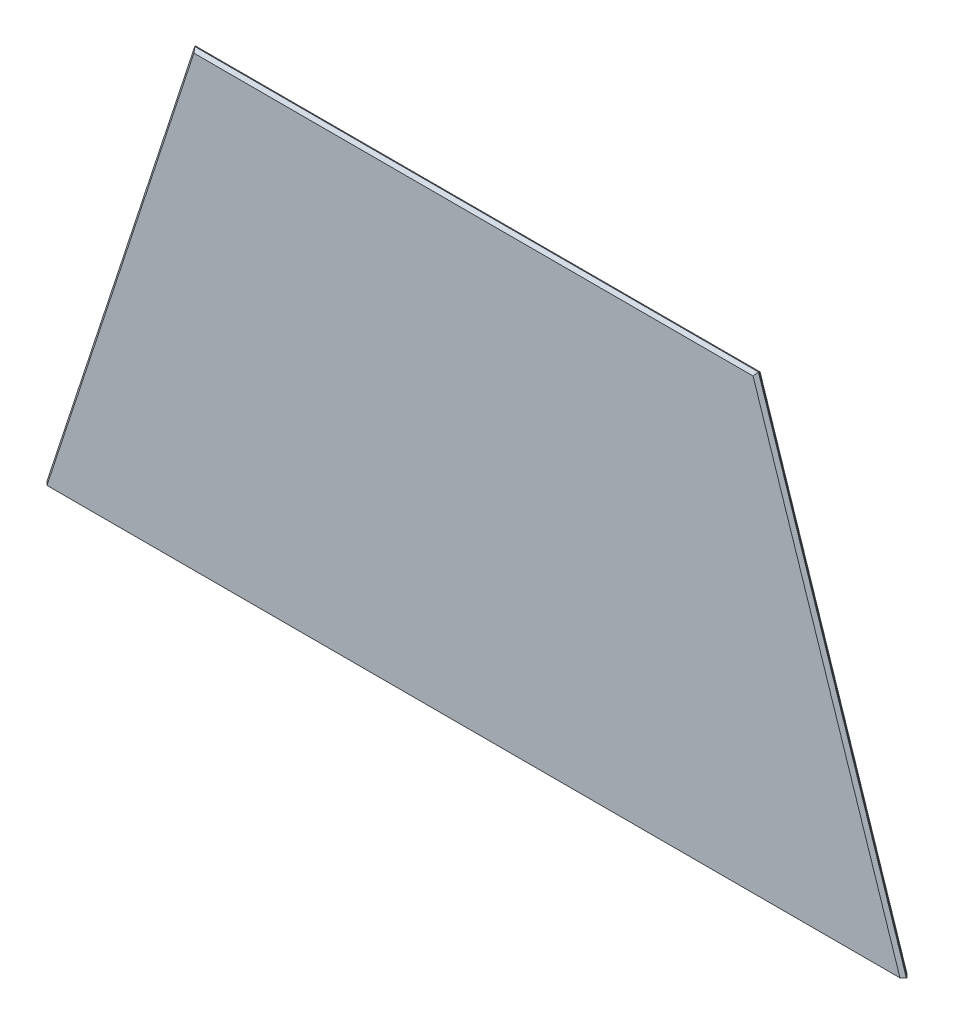
ISO-10303-21;
HEADER;
FILE_DESCRIPTION(('STEP AP214'),'2;1');
FILE_NAME('part.step','',(''),(''),'','','');
FILE_SCHEMA(('AUTOMOTIVE_DESIGN { 1 0 10303 214 1 1 1 1 }'));
ENDSEC;
DATA;
#1=APPLICATION_CONTEXT('core data for automotive mechanical design processes');
#2=APPLICATION_PROTOCOL_DEFINITION('international standard','automotive_design',2000,#1);
#3=PRODUCT_CONTEXT('',#1,'mechanical');
#4=PRODUCT('Part','Part','',(#3));
#5=PRODUCT_RELATED_PRODUCT_CATEGORY('part','',(#4));
#6=PRODUCT_DEFINITION_FORMATION('','',#4);
#7=PRODUCT_DEFINITION_CONTEXT('part definition',#1,'design');
#8=PRODUCT_DEFINITION('design','',#6,#7);
#9=PRODUCT_DEFINITION_SHAPE('','',#8);
#10=(LENGTH_UNIT() NAMED_UNIT(*) SI_UNIT(.MILLI.,.METRE.));
#11=(NAMED_UNIT(*) PLANE_ANGLE_UNIT() SI_UNIT($,.RADIAN.));
#12=(NAMED_UNIT(*) SI_UNIT($,.STERADIAN.) SOLID_ANGLE_UNIT());
#13=UNCERTAINTY_MEASURE_WITH_UNIT(LENGTH_MEASURE(1.E-05),#10,'distance_accuracy_value','');
#14=(GEOMETRIC_REPRESENTATION_CONTEXT(3) GLOBAL_UNCERTAINTY_ASSIGNED_CONTEXT((#13)) GLOBAL_UNIT_ASSIGNED_CONTEXT((#10,
#11,#12)) REPRESENTATION_CONTEXT('',''));
#15=CARTESIAN_POINT('',(0.,0.,0.));
#16=DIRECTION('',(0.,0.,1.));
#17=DIRECTION('',(1.,0.,0.));
#18=AXIS2_PLACEMENT_3D('',#15,#16,#17);
#19=CARTESIAN_POINT('',(0.,0.,1.5875));
#20=DIRECTION('',(0.,1.,0.));
#21=DIRECTION('',(0.,0.,1.));
#22=AXIS2_PLACEMENT_3D('',#19,#20,#21);
#23=PLANE('',#22);
#24=DIRECTION('',(1.,0.,0.));
#25=VECTOR('',#24,1.);
#26=CARTESIAN_POINT('',(0.,0.,-1.5875));
#27=LINE('',#26,#25);
#28=CARTESIAN_POINT('',(-192.204717385981,0.,-1.5875));
#29=VERTEX_POINT('',#28);
#30=CARTESIAN_POINT('',(192.204717385981,0.,-1.58749999999998));
#31=VERTEX_POINT('',#30);
#32=EDGE_CURVE('E159',#29,#31,#27,.T.);
#33=ORIENTED_EDGE('',*,*,#32,.T.);
#34=DIRECTION('',(-0.724942429921074,0.,-0.688809460809104));
#35=VECTOR('',#34,1.);
#36=CARTESIAN_POINT('',(193.675,0.,-0.190500000000129));
#37=LINE('',#36,#35);
#38=CARTESIAN_POINT('',(193.675,0.,-0.19050000000013));
#39=VERTEX_POINT('',#38);
#40=EDGE_CURVE('E130',#31,#39,#37,.F.);
#41=ORIENTED_EDGE('',*,*,#40,.T.);
#42=DIRECTION('',(0.,0.,-1.));
#43=VECTOR('',#42,1.);
#44=CARTESIAN_POINT('',(193.675,0.,1.5875));
#45=LINE('',#44,#43);
#46=CARTESIAN_POINT('',(193.675,0.,0.190499999999915));
#47=VERTEX_POINT('',#46);
#48=EDGE_CURVE('E141',#47,#39,#45,.T.);
#49=ORIENTED_EDGE('',*,*,#48,.F.);
#50=DIRECTION('',(-0.724942429921077,0.,0.688809460809101));
#51=VECTOR('',#50,1.);
#52=CARTESIAN_POINT('',(192.279823911265,0.,1.51613697440055));
#53=LINE('',#52,#51);
#54=CARTESIAN_POINT('',(192.204717385981,0.,1.58749999999994));
#55=VERTEX_POINT('',#54);
#56=EDGE_CURVE('E145',#47,#55,#53,.T.);
#57=ORIENTED_EDGE('',*,*,#56,.T.);
#58=DIRECTION('',(1.,0.,0.));
#59=VECTOR('',#58,1.);
#60=CARTESIAN_POINT('',(-193.675,0.,1.5875));
#61=LINE('',#60,#59);
#62=CARTESIAN_POINT('',(-192.20471738598,0.,1.58749999999999));
#63=VERTEX_POINT('',#62);
#64=EDGE_CURVE('E199',#63,#55,#61,.T.);
#65=ORIENTED_EDGE('',*,*,#64,.F.);
#66=DIRECTION('',(-0.724942429921092,0.,-0.688809460809085));
#67=VECTOR('',#66,1.);
#68=CARTESIAN_POINT('',(-172.492803176873,0.,20.3169224168507));
#69=LINE('',#68,#67);
#70=CARTESIAN_POINT('',(-193.675,0.,0.1904999999999));
#71=VERTEX_POINT('',#70);
#72=EDGE_CURVE('E181',#63,#71,#69,.T.);
#73=ORIENTED_EDGE('',*,*,#72,.T.);
#74=DIRECTION('',(0.,0.,-1.));
#75=VECTOR('',#74,1.);
#76=CARTESIAN_POINT('',(-193.675,0.,1.5875));
#77=LINE('',#76,#75);
#78=CARTESIAN_POINT('',(-193.675,0.,-0.190500000000136));
#79=VERTEX_POINT('',#78);
#80=EDGE_CURVE('E196',#71,#79,#77,.T.);
#81=ORIENTED_EDGE('',*,*,#80,.T.);
#82=DIRECTION('',(-0.724942429921075,0.,0.688809460809103));
#83=VECTOR('',#82,1.);
#84=CARTESIAN_POINT('',(-158.634518707286,0.,-33.4844748448075));
#85=LINE('',#84,#83);
#86=EDGE_CURVE('E177',#79,#29,#85,.F.);
#87=ORIENTED_EDGE('',*,*,#86,.T.);
#88=EDGE_LOOP('',(#33,#41,#49,#57,#65,#73,#81,#87));
#89=FACE_BOUND('',#88,.T.);
#90=ADVANCED_FACE('F38',(#89),#23,.F.);
#91=CARTESIAN_POINT('',(193.675,0.,1.5875));
#92=DIRECTION('',(-0.950157464068001,-0.311770417897313,0.));
#93=DIRECTION('',(0.311770417897313,-0.950157464068001,0.));
#94=AXIS2_PLACEMENT_3D('',#91,#92,#93);
#95=PLANE('',#94);
#96=ORIENTED_EDGE('',*,*,#48,.T.);
#97=DIRECTION('',(-0.311770417897313,0.950157464068001,0.));
#98=VECTOR('',#97,1.);
#99=CARTESIAN_POINT('',(193.675,0.,-0.190500000000138));
#100=LINE('',#99,#98);
#101=CARTESIAN_POINT('',(127.,203.2,-0.190500000000129));
#102=VERTEX_POINT('',#101);
#103=EDGE_CURVE('E139',#39,#102,#100,.T.);
#104=ORIENTED_EDGE('',*,*,#103,.T.);
#105=DIRECTION('',(0.,0.,-1.));
#106=VECTOR('',#105,1.);
#107=CARTESIAN_POINT('',(127.,203.2,1.5875));
#108=LINE('',#107,#106);
#109=CARTESIAN_POINT('',(127.,203.2,0.190499999999907));
#110=VERTEX_POINT('',#109);
#111=EDGE_CURVE('E122',#110,#102,#108,.T.);
#112=ORIENTED_EDGE('',*,*,#111,.F.);
#113=DIRECTION('',(0.311770417897313,-0.950157464068001,0.));
#114=VECTOR('',#113,1.);
#115=CARTESIAN_POINT('',(193.675,0.,0.190499999999907));
#116=LINE('',#115,#114);
#117=EDGE_CURVE('E136',#110,#47,#116,.T.);
#118=ORIENTED_EDGE('',*,*,#117,.T.);
#119=EDGE_LOOP('',(#96,#104,#112,#118));
#120=FACE_BOUND('',#119,.T.);
#121=ADVANCED_FACE('F135',(#120),#95,.F.);
#122=CARTESIAN_POINT('',(0.,203.2,1.5875));
#123=DIRECTION('',(0.,-1.,0.));
#124=DIRECTION('',(0.,0.,-1.));
#125=AXIS2_PLACEMENT_3D('',#122,#123,#124);
#126=PLANE('',#125);
#127=ORIENTED_EDGE('',*,*,#111,.T.);
#128=DIRECTION('',(-1.,0.,0.));
#129=VECTOR('',#128,1.);
#130=CARTESIAN_POINT('',(0.,203.2,-0.190500000000129));
#131=LINE('',#130,#129);
#132=CARTESIAN_POINT('',(-127.,203.2,-0.190500000000129));
#133=VERTEX_POINT('',#132);
#134=EDGE_CURVE('E129',#102,#133,#131,.T.);
#135=ORIENTED_EDGE('',*,*,#134,.T.);
#136=DIRECTION('',(0.,0.,-1.));
#137=VECTOR('',#136,1.);
#138=CARTESIAN_POINT('',(-127.,203.2,1.5875));
#139=LINE('',#138,#137);
#140=CARTESIAN_POINT('',(-127.,203.2,0.190499999999907));
#141=VERTEX_POINT('',#140);
#142=EDGE_CURVE('E124',#141,#133,#139,.T.);
#143=ORIENTED_EDGE('',*,*,#142,.F.);
#144=DIRECTION('',(1.,0.,0.));
#145=VECTOR('',#144,1.);
#146=CARTESIAN_POINT('',(127.,203.2,0.190499999999907));
#147=LINE('',#146,#145);
#148=EDGE_CURVE('E119',#141,#110,#147,.T.);
#149=ORIENTED_EDGE('',*,*,#148,.T.);
#150=EDGE_LOOP('',(#127,#135,#143,#149));
#151=FACE_BOUND('',#150,.T.);
#152=ADVANCED_FACE('F121',(#151),#126,.F.);
#153=CARTESIAN_POINT('',(-127.,203.2,1.5875));
#154=DIRECTION('',(0.950157464068001,-0.311770417897313,0.));
#155=DIRECTION('',(0.311770417897313,0.950157464068001,0.));
#156=AXIS2_PLACEMENT_3D('',#153,#154,#155);
#157=PLANE('',#156);
#158=ORIENTED_EDGE('',*,*,#142,.T.);
#159=DIRECTION('',(-0.311770417897313,-0.950157464068001,0.));
#160=VECTOR('',#159,1.);
#161=CARTESIAN_POINT('',(-127.,203.2,-0.190500000000142));
#162=LINE('',#161,#160);
#163=EDGE_CURVE('E167',#133,#79,#162,.T.);
#164=ORIENTED_EDGE('',*,*,#163,.T.);
#165=ORIENTED_EDGE('',*,*,#80,.F.);
#166=DIRECTION('',(0.311770417897313,0.950157464068001,0.));
#167=VECTOR('',#166,1.);
#168=CARTESIAN_POINT('',(-127.,203.2,0.1904999999999));
#169=LINE('',#168,#167);
#170=EDGE_CURVE('E170',#71,#141,#169,.T.);
#171=ORIENTED_EDGE('',*,*,#170,.T.);
#172=EDGE_LOOP('',(#158,#164,#165,#171));
#173=FACE_BOUND('',#172,.T.);
#174=ADVANCED_FACE('F213',(#173),#157,.F.);
#175=CARTESIAN_POINT('',(193.675,0.,1.5875));
#176=DIRECTION('',(0.,0.,1.));
#177=DIRECTION('',(1.,0.,0.));
#178=AXIS2_PLACEMENT_3D('',#175,#176,#177);
#179=PLANE('',#178);
#180=ORIENTED_EDGE('',*,*,#64,.T.);
#181=DIRECTION('',(-0.311770417897313,0.950157464068001,0.));
#182=VECTOR('',#181,1.);
#183=CARTESIAN_POINT('',(125.672630022697,202.764456726197,1.5875));
#184=LINE('',#183,#182);
#185=CARTESIAN_POINT('',(125.98810801098,201.803,1.5875));
#186=VERTEX_POINT('',#185);
#187=EDGE_CURVE('E11',#55,#186,#184,.T.);
#188=ORIENTED_EDGE('',*,*,#187,.T.);
#189=DIRECTION('',(-1.,0.,0.));
#190=VECTOR('',#189,1.);
#191=CARTESIAN_POINT('',(-127.,201.803,1.5875));
#192=LINE('',#191,#190);
#193=CARTESIAN_POINT('',(-125.98810801098,201.803,1.5875));
#194=VERTEX_POINT('',#193);
#195=EDGE_CURVE('E48',#186,#194,#192,.T.);
#196=ORIENTED_EDGE('',*,*,#195,.T.);
#197=DIRECTION('',(-0.311770417897313,-0.950157464068001,0.));
#198=VECTOR('',#197,1.);
#199=CARTESIAN_POINT('',(-192.347630022697,-0.4355432738026,1.5875));
#200=LINE('',#199,#198);
#201=EDGE_CURVE('E164',#194,#63,#200,.T.);
#202=ORIENTED_EDGE('',*,*,#201,.T.);
#203=EDGE_LOOP('',(#180,#188,#196,#202));
#204=FACE_BOUND('',#203,.T.);
#205=ADVANCED_FACE('F206',(#204),#179,.T.);
#206=CARTESIAN_POINT('',(193.675,0.,-1.5875));
#207=DIRECTION('',(0.,0.,1.));
#208=DIRECTION('',(1.,0.,0.));
#209=AXIS2_PLACEMENT_3D('',#206,#207,#208);
#210=PLANE('',#209);
#211=DIRECTION('',(1.,0.,0.));
#212=VECTOR('',#211,1.);
#213=CARTESIAN_POINT('',(193.675,201.803,-1.5875));
#214=LINE('',#213,#212);
#215=CARTESIAN_POINT('',(-125.988108010981,201.803,-1.5875));
#216=VERTEX_POINT('',#215);
#217=CARTESIAN_POINT('',(125.988108010981,201.803,-1.5875));
#218=VERTEX_POINT('',#217);
#219=EDGE_CURVE('E186',#216,#218,#214,.T.);
#220=ORIENTED_EDGE('',*,*,#219,.T.);
#221=DIRECTION('',(0.311770417897313,-0.950157464068001,0.));
#222=VECTOR('',#221,1.);
#223=CARTESIAN_POINT('',(192.347630022697,-0.435543273802505,-1.5875));
#224=LINE('',#223,#222);
#225=EDGE_CURVE('E183',#218,#31,#224,.T.);
#226=ORIENTED_EDGE('',*,*,#225,.T.);
#227=ORIENTED_EDGE('',*,*,#32,.F.);
#228=DIRECTION('',(0.311770417897313,0.950157464068001,0.));
#229=VECTOR('',#228,1.);
#230=CARTESIAN_POINT('',(-154.696902669821,114.309530563535,-1.5875));
#231=LINE('',#230,#229);
#232=EDGE_CURVE('E189',#29,#216,#231,.T.);
#233=ORIENTED_EDGE('',*,*,#232,.T.);
#234=EDGE_LOOP('',(#220,#226,#227,#233));
#235=FACE_BOUND('',#234,.T.);
#236=ADVANCED_FACE('F223',(#235),#210,.F.);
#237=CARTESIAN_POINT('',(-127.,203.2,-0.190500000000129));
#238=DIRECTION('',(0.671862786037497,-0.220454976668554,0.707106781186548));
#239=DIRECTION('',(0.724942429921075,0.,-0.688809460809103));
#240=AXIS2_PLACEMENT_3D('',#237,#238,#239);
#241=PLANE('',#240);
#242=ORIENTED_EDGE('',*,*,#86,.F.);
#243=ORIENTED_EDGE('',*,*,#163,.F.);
#244=DIRECTION('',(0.455865322345581,-0.629359518829564,-0.629359518829564));
#245=VECTOR('',#244,1.);
#246=CARTESIAN_POINT('',(-127.,203.2,-0.190500000000129));
#247=LINE('',#246,#245);
#248=EDGE_CURVE('E155',#216,#133,#247,.F.);
#249=ORIENTED_EDGE('',*,*,#248,.F.);
#250=ORIENTED_EDGE('',*,*,#232,.F.);
#251=EDGE_LOOP('',(#242,#243,#249,#250));
#252=FACE_BOUND('',#251,.T.);
#253=ADVANCED_FACE('F219',(#252),#241,.F.);
#254=CARTESIAN_POINT('',(0.,203.2,-0.190500000000129));
#255=DIRECTION('',(0.,-0.707106781186548,0.707106781186548));
#256=DIRECTION('',(0.,-0.707106781186548,-0.707106781186548));
#257=AXIS2_PLACEMENT_3D('',#254,#255,#256);
#258=PLANE('',#257);
#259=ORIENTED_EDGE('',*,*,#248,.T.);
#260=ORIENTED_EDGE('',*,*,#134,.F.);
#261=DIRECTION('',(-0.45586532234558,-0.629359518829564,-0.629359518829564));
#262=VECTOR('',#261,1.);
#263=CARTESIAN_POINT('',(100.607724601111,166.763296149843,-36.6272038501574));
#264=LINE('',#263,#262);
#265=EDGE_CURVE('E153',#218,#102,#264,.F.);
#266=ORIENTED_EDGE('',*,*,#265,.F.);
#267=ORIENTED_EDGE('',*,*,#219,.F.);
#268=EDGE_LOOP('',(#259,#260,#266,#267));
#269=FACE_BOUND('',#268,.T.);
#270=ADVANCED_FACE('F231',(#269),#258,.F.);
#271=CARTESIAN_POINT('',(193.675,0.,-0.190500000000129));
#272=DIRECTION('',(-0.671862786037498,-0.220454976668554,0.707106781186547));
#273=DIRECTION('',(0.724942429921074,0.,0.688809460809104));
#274=AXIS2_PLACEMENT_3D('',#271,#272,#273);
#275=PLANE('',#274);
#276=ORIENTED_EDGE('',*,*,#40,.F.);
#277=ORIENTED_EDGE('',*,*,#225,.F.);
#278=ORIENTED_EDGE('',*,*,#265,.T.);
#279=ORIENTED_EDGE('',*,*,#103,.F.);
#280=EDGE_LOOP('',(#276,#277,#278,#279));
#281=FACE_BOUND('',#280,.T.);
#282=ADVANCED_FACE('F227',(#281),#275,.F.);
#283=CARTESIAN_POINT('',(-154.696902669821,114.309530563535,1.5875));
#284=DIRECTION('',(-0.67186278603748,0.220454976668548,0.707106781186565));
#285=DIRECTION('',(0.724942429921092,0.,0.688809460809085));
#286=AXIS2_PLACEMENT_3D('',#283,#284,#285);
#287=PLANE('',#286);
#288=ORIENTED_EDGE('',*,*,#72,.F.);
#289=ORIENTED_EDGE('',*,*,#201,.F.);
#290=DIRECTION('',(-0.455865322345607,0.629359518829554,-0.629359518829554));
#291=VECTOR('',#290,1.);
#292=CARTESIAN_POINT('',(-106.852019667098,175.384058347634,28.0064416523659));
#293=LINE('',#292,#291);
#294=EDGE_CURVE('E42',#141,#194,#293,.F.);
#295=ORIENTED_EDGE('',*,*,#294,.F.);
#296=ORIENTED_EDGE('',*,*,#170,.F.);
#297=EDGE_LOOP('',(#288,#289,#295,#296));
#298=FACE_BOUND('',#297,.T.);
#299=ADVANCED_FACE('F40',(#298),#287,.T.);
#300=CARTESIAN_POINT('',(193.675,201.803,1.5875));
#301=DIRECTION('',(0.,0.707106781186548,0.707106781186548));
#302=DIRECTION('',(0.,-0.707106781186548,0.707106781186548));
#303=AXIS2_PLACEMENT_3D('',#300,#301,#302);
#304=PLANE('',#303);
#305=ORIENTED_EDGE('',*,*,#294,.T.);
#306=ORIENTED_EDGE('',*,*,#195,.F.);
#307=DIRECTION('',(0.455865322345584,0.629359518829562,-0.629359518829562));
#308=VECTOR('',#307,1.);
#309=CARTESIAN_POINT('',(140.054337099714,221.22258455072,-17.8320845507205));
#310=LINE('',#309,#308);
#311=EDGE_CURVE('E59',#110,#186,#310,.F.);
#312=ORIENTED_EDGE('',*,*,#311,.F.);
#313=ORIENTED_EDGE('',*,*,#148,.F.);
#314=EDGE_LOOP('',(#305,#306,#312,#313));
#315=FACE_BOUND('',#314,.T.);
#316=ADVANCED_FACE('F148',(#315),#304,.T.);
#317=CARTESIAN_POINT('',(192.347630022697,-0.435543273802578,1.5875));
#318=DIRECTION('',(0.671862786037495,0.220454976668553,0.70710678118655));
#319=DIRECTION('',(0.724942429921077,0.,-0.688809460809101));
#320=AXIS2_PLACEMENT_3D('',#317,#318,#319);
#321=PLANE('',#320);
#322=ORIENTED_EDGE('',*,*,#56,.F.);
#323=ORIENTED_EDGE('',*,*,#117,.F.);
#324=ORIENTED_EDGE('',*,*,#311,.T.);
#325=ORIENTED_EDGE('',*,*,#187,.F.);
#326=EDGE_LOOP('',(#322,#323,#324,#325));
#327=FACE_BOUND('',#326,.T.);
#328=ADVANCED_FACE('F144',(#327),#321,.T.);
#329=CLOSED_SHELL('',(#90,#121,#152,#174,#205,#236,#253,#270,#282,#299,#316,#328));
#330=MANIFOLD_SOLID_BREP('B2',#329);
#331=ADVANCED_BREP_SHAPE_REPRESENTATION('',(#18,#330),#14);
#332=SHAPE_DEFINITION_REPRESENTATION(#9,#331);
ENDSEC;
END-ISO-10303-21;
